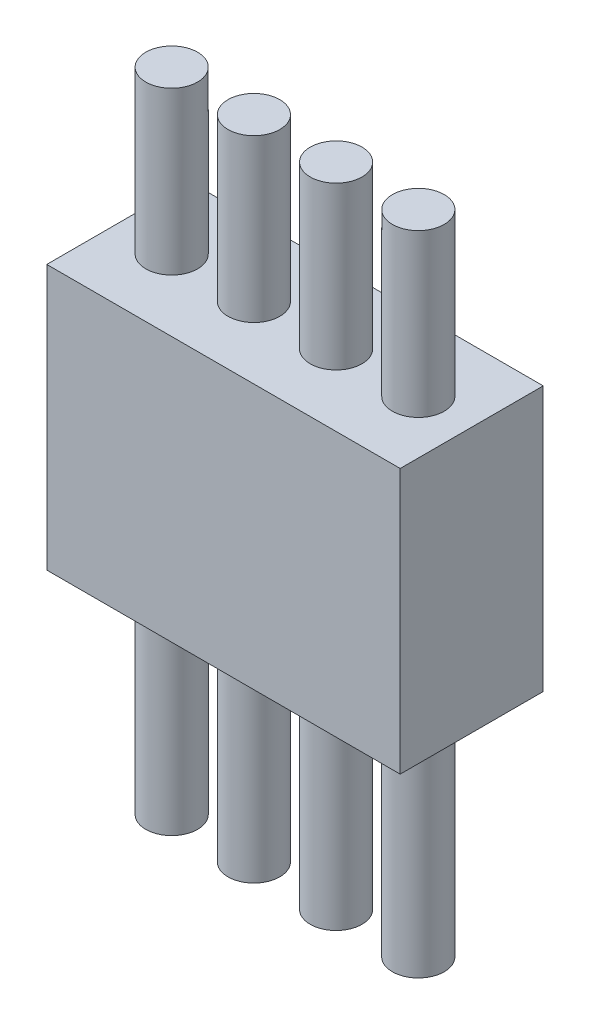
ISO-10303-21;
HEADER;
FILE_DESCRIPTION(('STEP AP214'),'2;1');
FILE_NAME('part.step','',(''),(''),'','','');
FILE_SCHEMA(('AUTOMOTIVE_DESIGN { 1 0 10303 214 1 1 1 1 }'));
ENDSEC;
DATA;
#1=APPLICATION_CONTEXT('core data for automotive mechanical design processes');
#2=APPLICATION_PROTOCOL_DEFINITION('international standard','automotive_design',2000,#1);
#3=PRODUCT_CONTEXT('',#1,'mechanical');
#4=PRODUCT('Part','Part','',(#3));
#5=PRODUCT_RELATED_PRODUCT_CATEGORY('part','',(#4));
#6=PRODUCT_DEFINITION_FORMATION('','',#4);
#7=PRODUCT_DEFINITION_CONTEXT('part definition',#1,'design');
#8=PRODUCT_DEFINITION('design','',#6,#7);
#9=PRODUCT_DEFINITION_SHAPE('','',#8);
#10=(LENGTH_UNIT() NAMED_UNIT(*) SI_UNIT(.MILLI.,.METRE.));
#11=(NAMED_UNIT(*) PLANE_ANGLE_UNIT() SI_UNIT($,.RADIAN.));
#12=(NAMED_UNIT(*) SI_UNIT($,.STERADIAN.) SOLID_ANGLE_UNIT());
#13=UNCERTAINTY_MEASURE_WITH_UNIT(LENGTH_MEASURE(1.E-05),#10,'distance_accuracy_value','');
#14=(GEOMETRIC_REPRESENTATION_CONTEXT(3) GLOBAL_UNCERTAINTY_ASSIGNED_CONTEXT((#13)) GLOBAL_UNIT_ASSIGNED_CONTEXT((#10,
#11,#12)) REPRESENTATION_CONTEXT('',''));
#15=CARTESIAN_POINT('',(0.,0.,0.));
#16=DIRECTION('',(0.,0.,1.));
#17=DIRECTION('',(1.,0.,0.));
#18=AXIS2_PLACEMENT_3D('',#15,#16,#17);
#19=CARTESIAN_POINT('',(-2.73,2.045,1.105));
#20=DIRECTION('',(0.,-1.,0.));
#21=DIRECTION('',(0.,0.,-1.));
#22=AXIS2_PLACEMENT_3D('',#19,#20,#21);
#23=PLANE('',#22);
#24=CARTESIAN_POINT('',(0.635,2.045,0.));
#25=DIRECTION('',(0.,-1.,0.));
#26=DIRECTION('',(0.,0.,-1.));
#27=AXIS2_PLACEMENT_3D('',#24,#25,#26);
#28=CIRCLE('',#27,0.4);
#29=CARTESIAN_POINT('',(0.635,2.045,-0.4));
#30=VERTEX_POINT('',#29);
#31=EDGE_CURVE('E121',#30,#30,#28,.F.);
#32=ORIENTED_EDGE('',*,*,#31,.F.);
#33=EDGE_LOOP('',(#32));
#34=FACE_BOUND('',#33,.T.);
#35=CARTESIAN_POINT('',(-1.905,2.045,0.));
#36=DIRECTION('',(0.,-1.,0.));
#37=DIRECTION('',(0.,0.,-1.));
#38=AXIS2_PLACEMENT_3D('',#35,#36,#37);
#39=CIRCLE('',#38,0.4);
#40=CARTESIAN_POINT('',(-1.905,2.045,-0.4));
#41=VERTEX_POINT('',#40);
#42=EDGE_CURVE('E115',#41,#41,#39,.F.);
#43=ORIENTED_EDGE('',*,*,#42,.F.);
#44=EDGE_LOOP('',(#43));
#45=FACE_BOUND('',#44,.T.);
#46=DIRECTION('',(-1.,0.,0.));
#47=VECTOR('',#46,1.);
#48=CARTESIAN_POINT('',(-2.73,2.045,-1.105));
#49=LINE('',#48,#47);
#50=CARTESIAN_POINT('',(2.73,2.045,-1.105));
#51=VERTEX_POINT('',#50);
#52=CARTESIAN_POINT('',(-2.73,2.045,-1.105));
#53=VERTEX_POINT('',#52);
#54=EDGE_CURVE('E92',#51,#53,#49,.T.);
#55=ORIENTED_EDGE('',*,*,#54,.T.);
#56=DIRECTION('',(0.,0.,-1.));
#57=VECTOR('',#56,1.);
#58=CARTESIAN_POINT('',(-2.73,2.045,1.105));
#59=LINE('',#58,#57);
#60=CARTESIAN_POINT('',(-2.73,2.045,1.105));
#61=VERTEX_POINT('',#60);
#62=EDGE_CURVE('E90',#61,#53,#59,.T.);
#63=ORIENTED_EDGE('',*,*,#62,.F.);
#64=DIRECTION('',(-1.,0.,0.));
#65=VECTOR('',#64,1.);
#66=CARTESIAN_POINT('',(-2.73,2.045,1.105));
#67=LINE('',#66,#65);
#68=CARTESIAN_POINT('',(2.73,2.045,1.105));
#69=VERTEX_POINT('',#68);
#70=EDGE_CURVE('E82',#69,#61,#67,.T.);
#71=ORIENTED_EDGE('',*,*,#70,.F.);
#72=DIRECTION('',(0.,0.,-1.));
#73=VECTOR('',#72,1.);
#74=CARTESIAN_POINT('',(2.73,2.045,1.105));
#75=LINE('',#74,#73);
#76=EDGE_CURVE('E93',#69,#51,#75,.T.);
#77=ORIENTED_EDGE('',*,*,#76,.T.);
#78=EDGE_LOOP('',(#55,#63,#71,#77));
#79=FACE_BOUND('',#78,.T.);
#80=CARTESIAN_POINT('',(-0.635,2.045,0.));
#81=DIRECTION('',(0.,-1.,0.));
#82=DIRECTION('',(0.,0.,-1.));
#83=AXIS2_PLACEMENT_3D('',#80,#81,#82);
#84=CIRCLE('',#83,0.4);
#85=CARTESIAN_POINT('',(-0.635,2.045,-0.4));
#86=VERTEX_POINT('',#85);
#87=EDGE_CURVE('E118',#86,#86,#84,.F.);
#88=ORIENTED_EDGE('',*,*,#87,.F.);
#89=EDGE_LOOP('',(#88));
#90=FACE_BOUND('',#89,.T.);
#91=CARTESIAN_POINT('',(1.905,2.045,0.));
#92=DIRECTION('',(0.,-1.,0.));
#93=DIRECTION('',(0.,0.,-1.));
#94=AXIS2_PLACEMENT_3D('',#91,#92,#93);
#95=CIRCLE('',#94,0.4);
#96=CARTESIAN_POINT('',(1.905,2.045,-0.4));
#97=VERTEX_POINT('',#96);
#98=EDGE_CURVE('E11',#97,#97,#95,.F.);
#99=ORIENTED_EDGE('',*,*,#98,.F.);
#100=EDGE_LOOP('',(#99));
#101=FACE_BOUND('',#100,.T.);
#102=ADVANCED_FACE('F33',(#34,#45,#79,#90,#101),#23,.F.);
#103=CARTESIAN_POINT('',(-2.73,-2.045,1.105));
#104=DIRECTION('',(0.,1.,0.));
#105=DIRECTION('',(0.,0.,1.));
#106=AXIS2_PLACEMENT_3D('',#103,#104,#105);
#107=PLANE('',#106);
#108=CARTESIAN_POINT('',(0.635,-2.045,0.));
#109=DIRECTION('',(0.,1.,0.));
#110=DIRECTION('',(0.,0.,1.));
#111=AXIS2_PLACEMENT_3D('',#108,#109,#110);
#112=CIRCLE('',#111,0.4);
#113=CARTESIAN_POINT('',(0.635,-2.045,0.4));
#114=VERTEX_POINT('',#113);
#115=EDGE_CURVE('E119',#114,#114,#112,.F.);
#116=ORIENTED_EDGE('',*,*,#115,.F.);
#117=EDGE_LOOP('',(#116));
#118=FACE_BOUND('',#117,.T.);
#119=CARTESIAN_POINT('',(-1.905,-2.045,0.));
#120=DIRECTION('',(0.,1.,0.));
#121=DIRECTION('',(0.,0.,1.));
#122=AXIS2_PLACEMENT_3D('',#119,#120,#121);
#123=CIRCLE('',#122,0.4);
#124=CARTESIAN_POINT('',(-1.905,-2.045,0.4));
#125=VERTEX_POINT('',#124);
#126=EDGE_CURVE('E112',#125,#125,#123,.F.);
#127=ORIENTED_EDGE('',*,*,#126,.F.);
#128=EDGE_LOOP('',(#127));
#129=FACE_BOUND('',#128,.T.);
#130=DIRECTION('',(1.,0.,0.));
#131=VECTOR('',#130,1.);
#132=CARTESIAN_POINT('',(-2.73,-2.045,-1.105));
#133=LINE('',#132,#131);
#134=CARTESIAN_POINT('',(-2.73,-2.045,-1.105));
#135=VERTEX_POINT('',#134);
#136=CARTESIAN_POINT('',(2.73,-2.045,-1.105));
#137=VERTEX_POINT('',#136);
#138=EDGE_CURVE('E74',#135,#137,#133,.T.);
#139=ORIENTED_EDGE('',*,*,#138,.T.);
#140=DIRECTION('',(0.,0.,-1.));
#141=VECTOR('',#140,1.);
#142=CARTESIAN_POINT('',(2.73,-2.045,1.105));
#143=LINE('',#142,#141);
#144=CARTESIAN_POINT('',(2.73,-2.045,1.105));
#145=VERTEX_POINT('',#144);
#146=EDGE_CURVE('E98',#145,#137,#143,.T.);
#147=ORIENTED_EDGE('',*,*,#146,.F.);
#148=DIRECTION('',(1.,0.,0.));
#149=VECTOR('',#148,1.);
#150=CARTESIAN_POINT('',(-2.73,-2.045,1.105));
#151=LINE('',#150,#149);
#152=CARTESIAN_POINT('',(-2.73,-2.045,1.105));
#153=VERTEX_POINT('',#152);
#154=EDGE_CURVE('E51',#153,#145,#151,.T.);
#155=ORIENTED_EDGE('',*,*,#154,.F.);
#156=DIRECTION('',(0.,0.,-1.));
#157=VECTOR('',#156,1.);
#158=CARTESIAN_POINT('',(-2.73,-2.045,1.105));
#159=LINE('',#158,#157);
#160=EDGE_CURVE('E94',#153,#135,#159,.T.);
#161=ORIENTED_EDGE('',*,*,#160,.T.);
#162=EDGE_LOOP('',(#139,#147,#155,#161));
#163=FACE_BOUND('',#162,.T.);
#164=CARTESIAN_POINT('',(-0.635,-2.045,0.));
#165=DIRECTION('',(0.,1.,0.));
#166=DIRECTION('',(0.,0.,1.));
#167=AXIS2_PLACEMENT_3D('',#164,#165,#166);
#168=CIRCLE('',#167,0.4);
#169=CARTESIAN_POINT('',(-0.635,-2.045,0.4));
#170=VERTEX_POINT('',#169);
#171=EDGE_CURVE('E116',#170,#170,#168,.F.);
#172=ORIENTED_EDGE('',*,*,#171,.F.);
#173=EDGE_LOOP('',(#172));
#174=FACE_BOUND('',#173,.T.);
#175=CARTESIAN_POINT('',(1.905,-2.045,0.));
#176=DIRECTION('',(0.,1.,0.));
#177=DIRECTION('',(0.,0.,1.));
#178=AXIS2_PLACEMENT_3D('',#175,#176,#177);
#179=CIRCLE('',#178,0.4);
#180=CARTESIAN_POINT('',(1.905,-2.045,0.4));
#181=VERTEX_POINT('',#180);
#182=EDGE_CURVE('E37',#181,#181,#179,.F.);
#183=ORIENTED_EDGE('',*,*,#182,.F.);
#184=EDGE_LOOP('',(#183));
#185=FACE_BOUND('',#184,.T.);
#186=ADVANCED_FACE('F146',(#118,#129,#163,#174,#185),#107,.F.);
#187=CARTESIAN_POINT('',(2.73,2.045,1.105));
#188=DIRECTION('',(-1.,0.,0.));
#189=DIRECTION('',(0.,-1.,0.));
#190=AXIS2_PLACEMENT_3D('',#187,#188,#189);
#191=PLANE('',#190);
#192=DIRECTION('',(0.,1.,0.));
#193=VECTOR('',#192,1.);
#194=CARTESIAN_POINT('',(2.73,2.045,-1.105));
#195=LINE('',#194,#193);
#196=EDGE_CURVE('E102',#137,#51,#195,.T.);
#197=ORIENTED_EDGE('',*,*,#196,.T.);
#198=ORIENTED_EDGE('',*,*,#76,.F.);
#199=DIRECTION('',(0.,1.,0.));
#200=VECTOR('',#199,1.);
#201=CARTESIAN_POINT('',(2.73,2.045,1.105));
#202=LINE('',#201,#200);
#203=EDGE_CURVE('E87',#145,#69,#202,.T.);
#204=ORIENTED_EDGE('',*,*,#203,.F.);
#205=ORIENTED_EDGE('',*,*,#146,.T.);
#206=EDGE_LOOP('',(#197,#198,#204,#205));
#207=FACE_BOUND('',#206,.T.);
#208=ADVANCED_FACE('F35',(#207),#191,.F.);
#209=CARTESIAN_POINT('',(-2.73,2.045,1.105));
#210=DIRECTION('',(1.,0.,0.));
#211=DIRECTION('',(0.,1.,0.));
#212=AXIS2_PLACEMENT_3D('',#209,#210,#211);
#213=PLANE('',#212);
#214=DIRECTION('',(0.,-1.,0.));
#215=VECTOR('',#214,1.);
#216=CARTESIAN_POINT('',(-2.73,2.045,-1.105));
#217=LINE('',#216,#215);
#218=EDGE_CURVE('E68',#53,#135,#217,.T.);
#219=ORIENTED_EDGE('',*,*,#218,.T.);
#220=ORIENTED_EDGE('',*,*,#160,.F.);
#221=DIRECTION('',(0.,-1.,0.));
#222=VECTOR('',#221,1.);
#223=CARTESIAN_POINT('',(-2.73,2.045,1.105));
#224=LINE('',#223,#222);
#225=EDGE_CURVE('E85',#61,#153,#224,.T.);
#226=ORIENTED_EDGE('',*,*,#225,.F.);
#227=ORIENTED_EDGE('',*,*,#62,.T.);
#228=EDGE_LOOP('',(#219,#220,#226,#227));
#229=FACE_BOUND('',#228,.T.);
#230=ADVANCED_FACE('F96',(#229),#213,.F.);
#231=CARTESIAN_POINT('',(0.,0.,1.105));
#232=DIRECTION('',(0.,0.,1.));
#233=DIRECTION('',(1.,0.,0.));
#234=AXIS2_PLACEMENT_3D('',#231,#232,#233);
#235=PLANE('',#234);
#236=ORIENTED_EDGE('',*,*,#203,.T.);
#237=ORIENTED_EDGE('',*,*,#70,.T.);
#238=ORIENTED_EDGE('',*,*,#225,.T.);
#239=ORIENTED_EDGE('',*,*,#154,.T.);
#240=EDGE_LOOP('',(#236,#237,#238,#239));
#241=FACE_BOUND('',#240,.T.);
#242=ADVANCED_FACE('F83',(#241),#235,.T.);
#243=CARTESIAN_POINT('',(0.,0.,-1.105));
#244=DIRECTION('',(0.,0.,1.));
#245=DIRECTION('',(1.,0.,0.));
#246=AXIS2_PLACEMENT_3D('',#243,#244,#245);
#247=PLANE('',#246);
#248=ORIENTED_EDGE('',*,*,#196,.F.);
#249=ORIENTED_EDGE('',*,*,#138,.F.);
#250=ORIENTED_EDGE('',*,*,#218,.F.);
#251=ORIENTED_EDGE('',*,*,#54,.F.);
#252=EDGE_LOOP('',(#248,#249,#250,#251));
#253=FACE_BOUND('',#252,.T.);
#254=ADVANCED_FACE('F157',(#253),#247,.F.);
#255=CARTESIAN_POINT('',(-1.905,-5.455,0.));
#256=DIRECTION('',(0.,1.,0.));
#257=DIRECTION('',(0.,0.,1.));
#258=AXIS2_PLACEMENT_3D('',#255,#256,#257);
#259=PLANE('',#258);
#260=CARTESIAN_POINT('',(-1.905,-5.455,0.));
#261=DIRECTION('',(0.,1.,0.));
#262=DIRECTION('',(0.,0.,1.));
#263=AXIS2_PLACEMENT_3D('',#260,#261,#262);
#264=CIRCLE('',#263,0.4);
#265=CARTESIAN_POINT('',(-1.905,-5.455,0.4));
#266=VERTEX_POINT('',#265);
#267=EDGE_CURVE('E136',#266,#266,#264,.T.);
#268=ORIENTED_EDGE('',*,*,#267,.F.);
#269=EDGE_LOOP('',(#268));
#270=FACE_BOUND('',#269,.T.);
#271=ADVANCED_FACE('F160',(#270),#259,.F.);
#272=CARTESIAN_POINT('',(-1.905,4.545,0.));
#273=DIRECTION('',(0.,-1.,0.));
#274=DIRECTION('',(0.,0.,-1.));
#275=AXIS2_PLACEMENT_3D('',#272,#273,#274);
#276=CYLINDRICAL_SURFACE('',#275,0.4);
#277=ORIENTED_EDGE('',*,*,#267,.T.);
#278=EDGE_LOOP('',(#277));
#279=FACE_BOUND('',#278,.T.);
#280=ORIENTED_EDGE('',*,*,#126,.T.);
#281=EDGE_LOOP('',(#280));
#282=FACE_BOUND('',#281,.T.);
#283=ADVANCED_FACE('F167',(#279,#282),#276,.T.);
#284=CARTESIAN_POINT('',(-1.905,4.545,0.));
#285=DIRECTION('',(0.,1.,0.));
#286=DIRECTION('',(0.,0.,1.));
#287=AXIS2_PLACEMENT_3D('',#284,#285,#286);
#288=CIRCLE('',#287,0.4);
#289=CARTESIAN_POINT('',(-1.905,4.545,0.4));
#290=VERTEX_POINT('',#289);
#291=EDGE_CURVE('E105',#290,#290,#288,.T.);
#292=ORIENTED_EDGE('',*,*,#291,.F.);
#293=EDGE_LOOP('',(#292));
#294=FACE_BOUND('',#293,.T.);
#295=ORIENTED_EDGE('',*,*,#42,.T.);
#296=EDGE_LOOP('',(#295));
#297=FACE_BOUND('',#296,.T.);
#298=ADVANCED_FACE('F143',(#294,#297),#276,.T.);
#299=CARTESIAN_POINT('',(-1.905,4.545,0.));
#300=DIRECTION('',(0.,1.,0.));
#301=DIRECTION('',(0.,0.,1.));
#302=AXIS2_PLACEMENT_3D('',#299,#300,#301);
#303=PLANE('',#302);
#304=ORIENTED_EDGE('',*,*,#291,.T.);
#305=EDGE_LOOP('',(#304));
#306=FACE_BOUND('',#305,.T.);
#307=ADVANCED_FACE('F166',(#306),#303,.T.);
#308=CARTESIAN_POINT('',(-0.635,-5.455,0.));
#309=DIRECTION('',(0.,1.,0.));
#310=DIRECTION('',(0.,0.,1.));
#311=AXIS2_PLACEMENT_3D('',#308,#309,#310);
#312=PLANE('',#311);
#313=CARTESIAN_POINT('',(-0.635,-5.455,0.));
#314=DIRECTION('',(0.,1.,0.));
#315=DIRECTION('',(0.,0.,1.));
#316=AXIS2_PLACEMENT_3D('',#313,#314,#315);
#317=CIRCLE('',#316,0.4);
#318=CARTESIAN_POINT('',(-0.635,-5.455,0.4));
#319=VERTEX_POINT('',#318);
#320=EDGE_CURVE('E132',#319,#319,#317,.T.);
#321=ORIENTED_EDGE('',*,*,#320,.F.);
#322=EDGE_LOOP('',(#321));
#323=FACE_BOUND('',#322,.T.);
#324=ADVANCED_FACE('F174',(#323),#312,.F.);
#325=CARTESIAN_POINT('',(-0.635,4.545,0.));
#326=DIRECTION('',(0.,-1.,0.));
#327=DIRECTION('',(0.,0.,-1.));
#328=AXIS2_PLACEMENT_3D('',#325,#326,#327);
#329=CYLINDRICAL_SURFACE('',#328,0.4);
#330=ORIENTED_EDGE('',*,*,#320,.T.);
#331=EDGE_LOOP('',(#330));
#332=FACE_BOUND('',#331,.T.);
#333=ORIENTED_EDGE('',*,*,#171,.T.);
#334=EDGE_LOOP('',(#333));
#335=FACE_BOUND('',#334,.T.);
#336=ADVANCED_FACE('F180',(#332,#335),#329,.T.);
#337=CARTESIAN_POINT('',(-0.635,4.545,0.));
#338=DIRECTION('',(0.,1.,0.));
#339=DIRECTION('',(0.,0.,1.));
#340=AXIS2_PLACEMENT_3D('',#337,#338,#339);
#341=CIRCLE('',#340,0.4);
#342=CARTESIAN_POINT('',(-0.635,4.545,0.4));
#343=VERTEX_POINT('',#342);
#344=EDGE_CURVE('E139',#343,#343,#341,.T.);
#345=ORIENTED_EDGE('',*,*,#344,.F.);
#346=EDGE_LOOP('',(#345));
#347=FACE_BOUND('',#346,.T.);
#348=ORIENTED_EDGE('',*,*,#87,.T.);
#349=EDGE_LOOP('',(#348));
#350=FACE_BOUND('',#349,.T.);
#351=ADVANCED_FACE('F176',(#347,#350),#329,.T.);
#352=CARTESIAN_POINT('',(-0.635,4.545,0.));
#353=DIRECTION('',(0.,1.,0.));
#354=DIRECTION('',(0.,0.,1.));
#355=AXIS2_PLACEMENT_3D('',#352,#353,#354);
#356=PLANE('',#355);
#357=ORIENTED_EDGE('',*,*,#344,.T.);
#358=EDGE_LOOP('',(#357));
#359=FACE_BOUND('',#358,.T.);
#360=ADVANCED_FACE('F179',(#359),#356,.T.);
#361=CARTESIAN_POINT('',(0.635,-5.455,0.));
#362=DIRECTION('',(0.,1.,0.));
#363=DIRECTION('',(0.,0.,1.));
#364=AXIS2_PLACEMENT_3D('',#361,#362,#363);
#365=PLANE('',#364);
#366=CARTESIAN_POINT('',(0.635,-5.455,0.));
#367=DIRECTION('',(0.,1.,0.));
#368=DIRECTION('',(0.,0.,1.));
#369=AXIS2_PLACEMENT_3D('',#366,#367,#368);
#370=CIRCLE('',#369,0.4);
#371=CARTESIAN_POINT('',(0.635,-5.455,0.4));
#372=VERTEX_POINT('',#371);
#373=EDGE_CURVE('E218',#372,#372,#370,.T.);
#374=ORIENTED_EDGE('',*,*,#373,.F.);
#375=EDGE_LOOP('',(#374));
#376=FACE_BOUND('',#375,.T.);
#377=ADVANCED_FACE('F187',(#376),#365,.F.);
#378=CARTESIAN_POINT('',(0.635,4.545,0.));
#379=DIRECTION('',(0.,-1.,0.));
#380=DIRECTION('',(0.,0.,-1.));
#381=AXIS2_PLACEMENT_3D('',#378,#379,#380);
#382=CYLINDRICAL_SURFACE('',#381,0.4);
#383=ORIENTED_EDGE('',*,*,#373,.T.);
#384=EDGE_LOOP('',(#383));
#385=FACE_BOUND('',#384,.T.);
#386=ORIENTED_EDGE('',*,*,#115,.T.);
#387=EDGE_LOOP('',(#386));
#388=FACE_BOUND('',#387,.T.);
#389=ADVANCED_FACE('F193',(#385,#388),#382,.T.);
#390=CARTESIAN_POINT('',(0.635,4.545,0.));
#391=DIRECTION('',(0.,1.,0.));
#392=DIRECTION('',(0.,0.,1.));
#393=AXIS2_PLACEMENT_3D('',#390,#391,#392);
#394=CIRCLE('',#393,0.4);
#395=CARTESIAN_POINT('',(0.635,4.545,0.4));
#396=VERTEX_POINT('',#395);
#397=EDGE_CURVE('E222',#396,#396,#394,.T.);
#398=ORIENTED_EDGE('',*,*,#397,.F.);
#399=EDGE_LOOP('',(#398));
#400=FACE_BOUND('',#399,.T.);
#401=ORIENTED_EDGE('',*,*,#31,.T.);
#402=EDGE_LOOP('',(#401));
#403=FACE_BOUND('',#402,.T.);
#404=ADVANCED_FACE('F189',(#400,#403),#382,.T.);
#405=CARTESIAN_POINT('',(0.635,4.545,0.));
#406=DIRECTION('',(0.,1.,0.));
#407=DIRECTION('',(0.,0.,1.));
#408=AXIS2_PLACEMENT_3D('',#405,#406,#407);
#409=PLANE('',#408);
#410=ORIENTED_EDGE('',*,*,#397,.T.);
#411=EDGE_LOOP('',(#410));
#412=FACE_BOUND('',#411,.T.);
#413=ADVANCED_FACE('F192',(#412),#409,.T.);
#414=CARTESIAN_POINT('',(1.905,-5.455,0.));
#415=DIRECTION('',(0.,1.,0.));
#416=DIRECTION('',(0.,0.,1.));
#417=AXIS2_PLACEMENT_3D('',#414,#415,#416);
#418=PLANE('',#417);
#419=CARTESIAN_POINT('',(1.905,-5.455,0.));
#420=DIRECTION('',(0.,1.,0.));
#421=DIRECTION('',(0.,0.,1.));
#422=AXIS2_PLACEMENT_3D('',#419,#420,#421);
#423=CIRCLE('',#422,0.4);
#424=CARTESIAN_POINT('',(1.905,-5.455,0.4));
#425=VERTEX_POINT('',#424);
#426=EDGE_CURVE('E219',#425,#425,#423,.T.);
#427=ORIENTED_EDGE('',*,*,#426,.F.);
#428=EDGE_LOOP('',(#427));
#429=FACE_BOUND('',#428,.T.);
#430=ADVANCED_FACE('F200',(#429),#418,.F.);
#431=CARTESIAN_POINT('',(1.905,4.545,0.));
#432=DIRECTION('',(0.,-1.,0.));
#433=DIRECTION('',(0.,0.,-1.));
#434=AXIS2_PLACEMENT_3D('',#431,#432,#433);
#435=CYLINDRICAL_SURFACE('',#434,0.4);
#436=ORIENTED_EDGE('',*,*,#426,.T.);
#437=EDGE_LOOP('',(#436));
#438=FACE_BOUND('',#437,.T.);
#439=ORIENTED_EDGE('',*,*,#182,.T.);
#440=EDGE_LOOP('',(#439));
#441=FACE_BOUND('',#440,.T.);
#442=ADVANCED_FACE('F206',(#438,#441),#435,.T.);
#443=CARTESIAN_POINT('',(1.905,4.545,0.));
#444=DIRECTION('',(0.,1.,0.));
#445=DIRECTION('',(0.,0.,1.));
#446=AXIS2_PLACEMENT_3D('',#443,#444,#445);
#447=CIRCLE('',#446,0.4);
#448=CARTESIAN_POINT('',(1.905,4.545,0.4));
#449=VERTEX_POINT('',#448);
#450=EDGE_CURVE('E217',#449,#449,#447,.T.);
#451=ORIENTED_EDGE('',*,*,#450,.F.);
#452=EDGE_LOOP('',(#451));
#453=FACE_BOUND('',#452,.T.);
#454=ORIENTED_EDGE('',*,*,#98,.T.);
#455=EDGE_LOOP('',(#454));
#456=FACE_BOUND('',#455,.T.);
#457=ADVANCED_FACE('F202',(#453,#456),#435,.T.);
#458=CARTESIAN_POINT('',(1.905,4.545,0.));
#459=DIRECTION('',(0.,1.,0.));
#460=DIRECTION('',(0.,0.,1.));
#461=AXIS2_PLACEMENT_3D('',#458,#459,#460);
#462=PLANE('',#461);
#463=ORIENTED_EDGE('',*,*,#450,.T.);
#464=EDGE_LOOP('',(#463));
#465=FACE_BOUND('',#464,.T.);
#466=ADVANCED_FACE('F205',(#465),#462,.T.);
#467=CLOSED_SHELL('',(#102,#186,#208,#230,#242,#254,#271,#283,#298,#307,#324,#336,#351,#360,
#377,#389,#404,#413,#430,#442,#457,#466));
#468=MANIFOLD_SOLID_BREP('B2',#467);
#469=ADVANCED_BREP_SHAPE_REPRESENTATION('',(#18,#468),#14);
#470=SHAPE_DEFINITION_REPRESENTATION(#9,#469);
ENDSEC;
END-ISO-10303-21;
